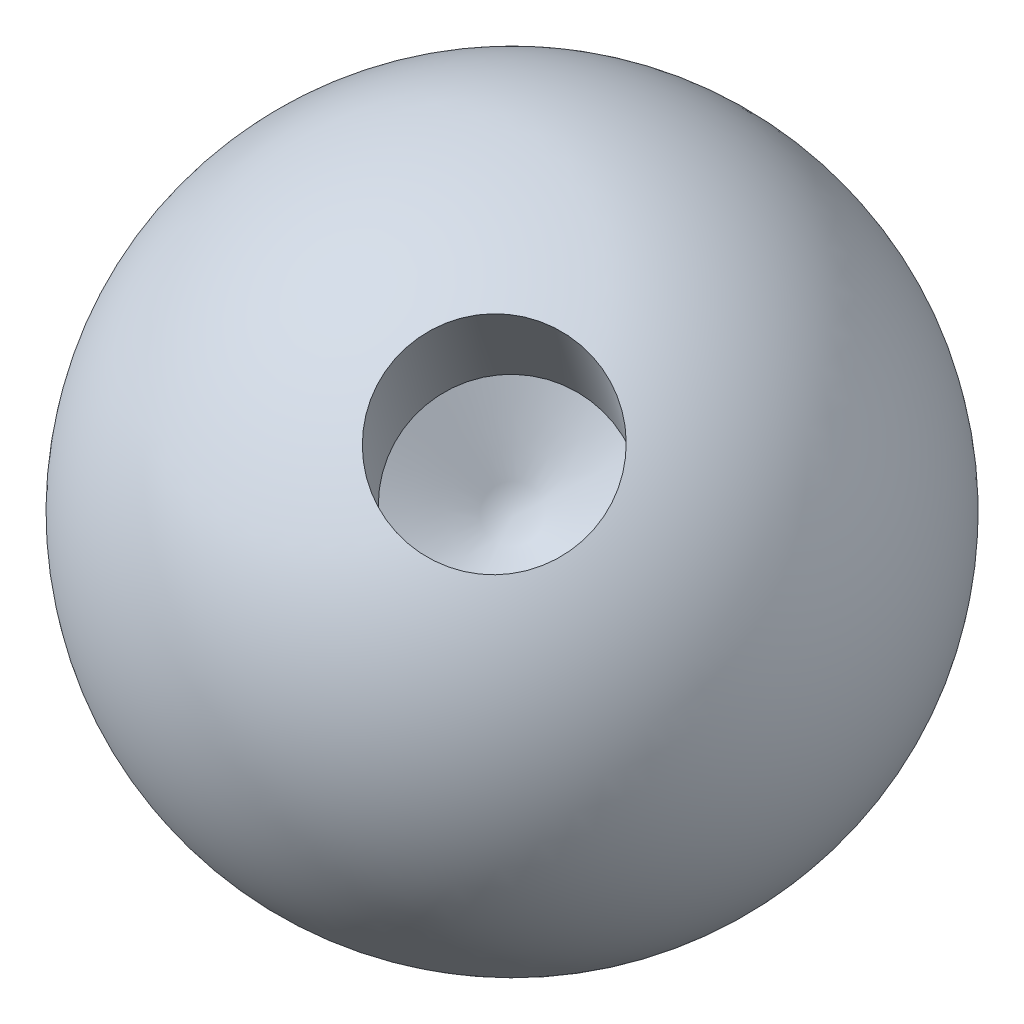
ISO-10303-21;
HEADER;
FILE_DESCRIPTION(('STEP AP214'),'2;1');
FILE_NAME('part.step','',(''),(''),'','','');
FILE_SCHEMA(('AUTOMOTIVE_DESIGN { 1 0 10303 214 1 1 1 1 }'));
ENDSEC;
DATA;
#1=APPLICATION_CONTEXT('core data for automotive mechanical design processes');
#2=APPLICATION_PROTOCOL_DEFINITION('international standard','automotive_design',2000,#1);
#3=PRODUCT_CONTEXT('',#1,'mechanical');
#4=PRODUCT('Part','Part','',(#3));
#5=PRODUCT_RELATED_PRODUCT_CATEGORY('part','',(#4));
#6=PRODUCT_DEFINITION_FORMATION('','',#4);
#7=PRODUCT_DEFINITION_CONTEXT('part definition',#1,'design');
#8=PRODUCT_DEFINITION('design','',#6,#7);
#9=PRODUCT_DEFINITION_SHAPE('','',#8);
#10=(LENGTH_UNIT() NAMED_UNIT(*) SI_UNIT(.MILLI.,.METRE.));
#11=(NAMED_UNIT(*) PLANE_ANGLE_UNIT() SI_UNIT($,.RADIAN.));
#12=(NAMED_UNIT(*) SI_UNIT($,.STERADIAN.) SOLID_ANGLE_UNIT());
#13=UNCERTAINTY_MEASURE_WITH_UNIT(LENGTH_MEASURE(1.E-05),#10,'distance_accuracy_value','');
#14=(GEOMETRIC_REPRESENTATION_CONTEXT(3) GLOBAL_UNCERTAINTY_ASSIGNED_CONTEXT((#13)) GLOBAL_UNIT_ASSIGNED_CONTEXT((#10,
#11,#12)) REPRESENTATION_CONTEXT('',''));
#15=CARTESIAN_POINT('',(0.,0.,0.));
#16=DIRECTION('',(0.,0.,1.));
#17=DIRECTION('',(1.,0.,0.));
#18=AXIS2_PLACEMENT_3D('',#15,#16,#17);
#19=CARTESIAN_POINT('',(0.,0.,0.));
#20=DIRECTION('',(0.,1.,0.));
#21=DIRECTION('',(1.,0.,0.));
#22=AXIS2_PLACEMENT_3D('',#19,#20,#21);
#23=SPHERICAL_SURFACE('',#22,15.);
#24=CARTESIAN_POINT('',(0.,0.,0.));
#25=DIRECTION('',(-0.480287700450639,-0.693790476650568,-0.536636282136062));
#26=DIRECTION('',(0.,0.611822535223667,-0.790995060283239));
#27=AXIS2_PLACEMENT_3D('',#24,#25,#26);
#28=SPHERICAL_SURFACE('',#27,15.);
#29=CARTESIAN_POINT('',(6.90909340652313,9.98039967135829,7.71968591976967));
#30=DIRECTION('',(-0.480287700450639,-0.693790476650568,-0.536636282136062));
#31=DIRECTION('',(0.,0.611822535223667,-0.790995060283239));
#32=AXIS2_PLACEMENT_3D('',#29,#30,#31);
#33=CIRCLE('',#32,4.25);
#34=CARTESIAN_POINT('',(6.90909340652313,12.5806454460589,4.35795691356591));
#35=VERTEX_POINT('',#34);
#36=EDGE_CURVE('E11',#35,#35,#33,.T.);
#37=ORIENTED_EDGE('',*,*,#36,.T.);
#38=EDGE_LOOP('',(#37));
#39=FACE_BOUND('',#38,.T.);
#40=ADVANCED_FACE('F39',(#39),#28,.T.);
#41=CARTESIAN_POINT('',(7.20431550675958,10.4068571497585,8.04954423204092));
#42=DIRECTION('',(0.480287700450639,0.693790476650568,0.536636282136062));
#43=DIRECTION('',(0.,-0.611822535223667,0.790995060283239));
#44=AXIS2_PLACEMENT_3D('',#41,#42,#43);
#45=CYLINDRICAL_SURFACE('',#44,4.25);
#46=CARTESIAN_POINT('',(0.720431550675956,1.04068571497585,0.804954423204086));
#47=DIRECTION('',(0.480287700450639,0.693790476650568,0.536636282136062));
#48=DIRECTION('',(0.,-0.611822535223667,0.790995060283239));
#49=AXIS2_PLACEMENT_3D('',#46,#47,#48);
#50=CIRCLE('',#49,4.25);
#51=CARTESIAN_POINT('',(0.720431550675956,-1.55956005972473,4.16668342940785));
#52=VERTEX_POINT('',#51);
#53=EDGE_CURVE('E45',#52,#52,#50,.T.);
#54=ORIENTED_EDGE('',*,*,#53,.F.);
#55=EDGE_LOOP('',(#54));
#56=FACE_BOUND('',#55,.T.);
#57=ORIENTED_EDGE('',*,*,#36,.F.);
#58=EDGE_LOOP('',(#57));
#59=FACE_BOUND('',#58,.T.);
#60=ADVANCED_FACE('F51',(#56,#59),#45,.F.);
#61=CARTESIAN_POINT('',(0.720431550675956,1.04068571497585,0.804954423204086));
#62=DIRECTION('',(0.480287700450639,0.693790476650568,0.536636282136062));
#63=DIRECTION('',(0.,-0.611822535223667,0.790995060283239));
#64=AXIS2_PLACEMENT_3D('',#61,#62,#63);
#65=CONICAL_SURFACE('',#64,4.25,1.02974425867665);
#66=CARTESIAN_POINT('',(-0.506058800591446,-0.731017629945815,-0.565430913672836));
#67=VERTEX_POINT('',#66);
#68=VERTEX_LOOP('',#67);
#69=FACE_BOUND('',#68,.T.);
#70=ORIENTED_EDGE('',*,*,#53,.T.);
#71=EDGE_LOOP('',(#70));
#72=FACE_BOUND('',#71,.T.);
#73=ADVANCED_FACE('F48',(#69,#72),#65,.F.);
#74=CLOSED_SHELL('',(#40,#60,#73));
#75=MANIFOLD_SOLID_BREP('B2',#74);
#76=ADVANCED_BREP_SHAPE_REPRESENTATION('',(#18,#75),#14);
#77=SHAPE_DEFINITION_REPRESENTATION(#9,#76);
ENDSEC;
END-ISO-10303-21;
